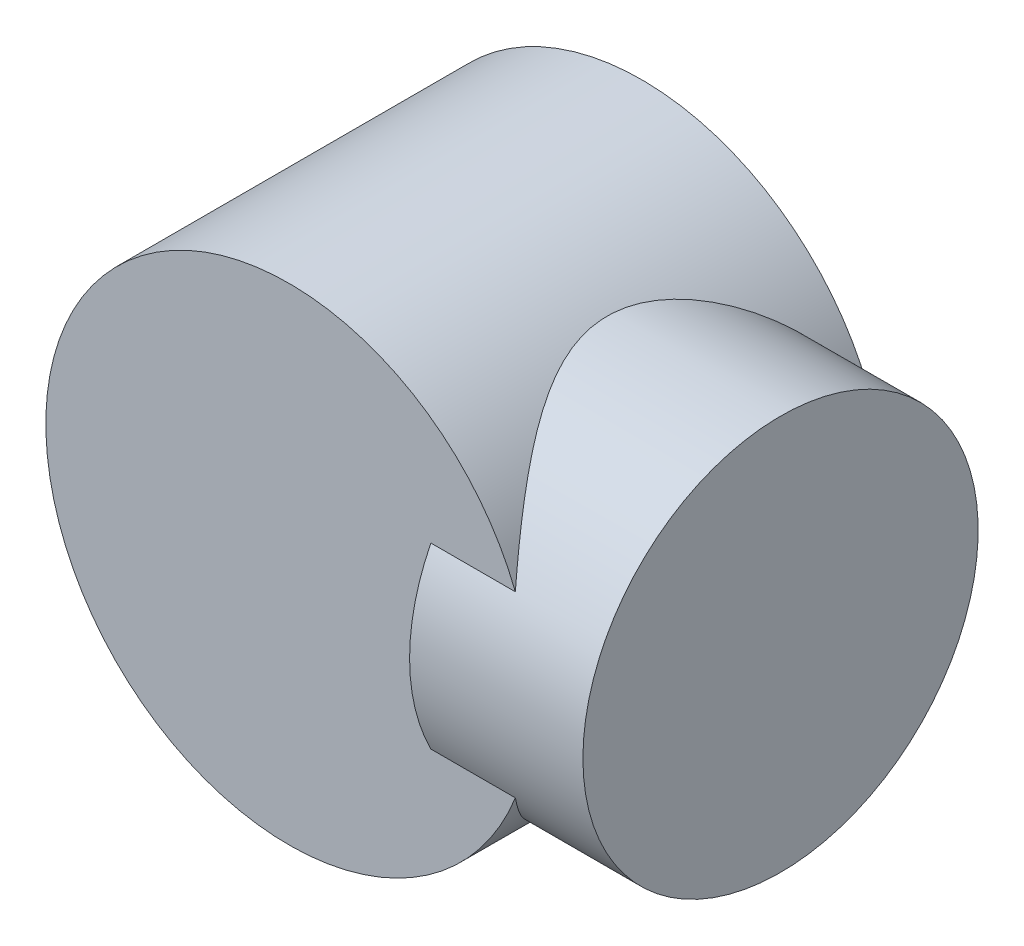
ISO-10303-21;
HEADER;
FILE_DESCRIPTION(('STEP AP214'),'2;1');
FILE_NAME('part.step','',(''),(''),'','','');
FILE_SCHEMA(('AUTOMOTIVE_DESIGN { 1 0 10303 214 1 1 1 1 }'));
ENDSEC;
DATA;
#1=APPLICATION_CONTEXT('core data for automotive mechanical design processes');
#2=APPLICATION_PROTOCOL_DEFINITION('international standard','automotive_design',2000,#1);
#3=PRODUCT_CONTEXT('',#1,'mechanical');
#4=PRODUCT('Part','Part','',(#3));
#5=PRODUCT_RELATED_PRODUCT_CATEGORY('part','',(#4));
#6=PRODUCT_DEFINITION_FORMATION('','',#4);
#7=PRODUCT_DEFINITION_CONTEXT('part definition',#1,'design');
#8=PRODUCT_DEFINITION('design','',#6,#7);
#9=PRODUCT_DEFINITION_SHAPE('','',#8);
#10=(LENGTH_UNIT() NAMED_UNIT(*) SI_UNIT(.MILLI.,.METRE.));
#11=(NAMED_UNIT(*) PLANE_ANGLE_UNIT() SI_UNIT($,.RADIAN.));
#12=(NAMED_UNIT(*) SI_UNIT($,.STERADIAN.) SOLID_ANGLE_UNIT());
#13=UNCERTAINTY_MEASURE_WITH_UNIT(LENGTH_MEASURE(1.E-05),#10,'distance_accuracy_value','');
#14=(GEOMETRIC_REPRESENTATION_CONTEXT(3) GLOBAL_UNCERTAINTY_ASSIGNED_CONTEXT((#13)) GLOBAL_UNIT_ASSIGNED_CONTEXT((#10,
#11,#12)) REPRESENTATION_CONTEXT('',''));
#15=CARTESIAN_POINT('',(0.,0.,0.));
#16=DIRECTION('',(0.,0.,1.));
#17=DIRECTION('',(1.,0.,0.));
#18=AXIS2_PLACEMENT_3D('',#15,#16,#17);
#19=CARTESIAN_POINT('',(0.,0.,0.));
#20=DIRECTION('',(-1.,0.,0.));
#21=DIRECTION('',(0.,-1.,0.));
#22=AXIS2_PLACEMENT_3D('',#19,#20,#21);
#23=SPHERICAL_SURFACE('',#22,40.);
#24=CARTESIAN_POINT('',(0.,0.,-29.));
#25=DIRECTION('',(0.,0.,1.));
#26=DIRECTION('',(1.,0.,0.));
#27=AXIS2_PLACEMENT_3D('',#24,#25,#26);
#28=CIRCLE('',#27,27.5499546279118);
#29=CARTESIAN_POINT('',(23.318447632722,14.6714007511212,-29.));
#30=VERTEX_POINT('',#29);
#31=CARTESIAN_POINT('',(23.318447632722,-14.6714007511212,-29.));
#32=VERTEX_POINT('',#31);
#33=EDGE_CURVE('E42',#30,#32,#28,.F.);
#34=ORIENTED_EDGE('',*,*,#33,.F.);
#35=CARTESIAN_POINT('',(23.318447632722,0.,0.));
#36=DIRECTION('',(-1.,0.,0.));
#37=DIRECTION('',(0.,0.,1.));
#38=AXIS2_PLACEMENT_3D('',#35,#36,#37);
#39=CIRCLE('',#38,32.5);
#40=EDGE_CURVE('E85',#30,#32,#39,.T.);
#41=ORIENTED_EDGE('',*,*,#40,.T.);
#42=EDGE_LOOP('',(#34,#41));
#43=FACE_BOUND('',#42,.T.);
#44=ADVANCED_FACE('F33',(#43),#23,.F.);
#45=CARTESIAN_POINT('',(-78.4468096761824,0.,0.));
#46=DIRECTION('',(-1.,0.,0.));
#47=DIRECTION('',(0.,0.,1.));
#48=AXIS2_PLACEMENT_3D('',#45,#46,#47);
#49=CYLINDRICAL_SURFACE('',#48,32.5);
#50=CARTESIAN_POINT('',(51.818447632722,0.,0.));
#51=DIRECTION('',(-1.,0.,0.));
#52=DIRECTION('',(0.,0.,1.));
#53=AXIS2_PLACEMENT_3D('',#50,#51,#52);
#54=CIRCLE('',#53,32.5);
#55=CARTESIAN_POINT('',(51.818447632722,0.,32.5));
#56=VERTEX_POINT('',#55);
#57=EDGE_CURVE('E86',#56,#56,#54,.T.);
#58=ORIENTED_EDGE('',*,*,#57,.T.);
#59=EDGE_LOOP('',(#58));
#60=FACE_BOUND('',#59,.T.);
#61=CARTESIAN_POINT('',(37.2122291726792,14.6714007511212,29.));
#62=CARTESIAN_POINT('',(37.0384167623299,15.1122605845425,28.7769598931221));
#63=CARTESIAN_POINT('',(36.8583653139083,15.5459710546819,28.5449194092489));
#64=CARTESIAN_POINT('',(36.4869726212096,16.398690521123,28.0637247785879));
#65=CARTESIAN_POINT('',(36.2956337705475,16.8177026045358,27.8145742583409));
#66=CARTESIAN_POINT('',(35.7069274397426,18.0511594606156,27.0433924829334));
#67=CARTESIAN_POINT('',(35.2943554901186,18.8433149043838,26.4969742635263));
#68=CARTESIAN_POINT('',(34.4389661407464,20.3646416146593,25.3464066607002));
#69=CARTESIAN_POINT('',(33.9961879944246,21.0938919367934,24.7423318101723));
#70=CARTESIAN_POINT('',(33.0890630414845,22.4901543823152,23.4803900810878));
#71=CARTESIAN_POINT('',(32.6247093172204,23.1571463350411,22.8225058978467));
#72=CARTESIAN_POINT('',(31.6865447527366,24.4250206612744,21.459966980059));
#73=CARTESIAN_POINT('',(31.2127936994698,25.0262206597636,20.7555659178486));
#74=CARTESIAN_POINT('',(30.2636386593102,26.1660469642867,19.2987938388735));
#75=CARTESIAN_POINT('',(29.7882345827837,26.7046698208677,18.5464201812426));
#76=CARTESIAN_POINT('',(28.8472012627928,27.718539044388,16.9938996965338));
#77=CARTESIAN_POINT('',(28.3815750117378,28.1937662411716,16.1937385244456));
#78=CARTESIAN_POINT('',(27.4742861337567,29.078589884962,14.5451167559236));
#79=CARTESIAN_POINT('',(27.0326135630219,29.4882137057492,13.6966765058424));
#80=CARTESIAN_POINT('',(26.3396542964211,30.1057468310995,12.2585321119091));
#81=CARTESIAN_POINT('',(26.0762188375706,30.3338033614416,11.6832764501992));
#82=CARTESIAN_POINT('',(25.5727008909894,30.7594785188378,10.5115632451592));
#83=CARTESIAN_POINT('',(25.3326168063888,30.9570992277676,9.91510715542229));
#84=CARTESIAN_POINT('',(24.8830956661389,31.3195594890496,8.70256673912427));
#85=CARTESIAN_POINT('',(24.6735915336505,31.484471082846,8.08652909530239));
#86=CARTESIAN_POINT('',(24.2921609603323,31.7796979439348,6.83476164913399));
#87=CARTESIAN_POINT('',(24.1202266862416,31.9100204242255,6.19903598333128));
#88=CARTESIAN_POINT('',(23.8474471419866,32.1142194620964,5.02190198469967));
#89=CARTESIAN_POINT('',(23.7394523194919,32.1939577848796,4.48317079551863));
#90=CARTESIAN_POINT('',(23.5584384095929,32.3266554532461,3.39657967097836));
#91=CARTESIAN_POINT('',(23.4854150208813,32.3796180921461,2.84872086685065));
#92=CARTESIAN_POINT('',(23.3774421585089,32.4576598958425,1.7477324855759));
#93=CARTESIAN_POINT('',(23.3424593266045,32.4827634909834,1.19460795614432));
#94=CARTESIAN_POINT('',(23.3120337380851,32.5046066425837,0.0866894809239509));
#95=CARTESIAN_POINT('',(23.3165914085461,32.5013458926804,-0.468104482831654));
#96=CARTESIAN_POINT('',(23.3650232160526,32.466545069523,-1.57472296858484));
#97=CARTESIAN_POINT('',(23.4088738003759,32.4350219371298,-2.12654907024808));
#98=CARTESIAN_POINT('',(23.5339022728001,32.3444175071453,-3.22361216932175));
#99=CARTESIAN_POINT('',(23.6150805988497,32.2853358862233,-3.7688490893474));
#100=CARTESIAN_POINT('',(23.8115856406616,32.1406784963566,-4.8502385324178));
#101=CARTESIAN_POINT('',(23.9269567259795,32.0550682965101,-5.38637828906145));
#102=CARTESIAN_POINT('',(24.1876912673613,31.8587850412282,-6.44659900183687));
#103=CARTESIAN_POINT('',(24.3330590289293,31.7481083877144,-6.97067821487026));
#104=CARTESIAN_POINT('',(24.7298388314471,31.4408327048534,-8.26843980965477));
#105=CARTESIAN_POINT('',(24.9975943232823,31.2291549584267,-9.03358734879068));
#106=CARTESIAN_POINT('',(25.5769690183773,30.7564364540254,-10.5313419382675));
#107=CARTESIAN_POINT('',(25.8886115949744,30.4953693667198,-11.2639313735405));
#108=CARTESIAN_POINT('',(26.544323340494,29.9263761922772,-12.6988036538835));
#109=CARTESIAN_POINT('',(26.8884981679764,29.6182952738407,-13.40097613849));
#110=CARTESIAN_POINT('',(27.5980112165351,28.9583237412365,-14.773120205246));
#111=CARTESIAN_POINT('',(27.9633480424754,28.6064360133434,-15.4430939048317));
#112=CARTESIAN_POINT('',(28.5874996235268,27.9800462844158,-16.5417224239395));
#113=CARTESIAN_POINT('',(28.8429039255966,27.7169151798442,-16.978865756075));
#114=CARTESIAN_POINT('',(29.3573508583995,27.1714291483286,-17.8387972457827));
#115=CARTESIAN_POINT('',(29.6163937101909,26.889073049335,-18.2615845257807));
#116=CARTESIAN_POINT('',(30.3960264718258,26.0133053232636,-19.508735076768));
#117=CARTESIAN_POINT('',(30.9190436378415,25.3912703550785,-20.3117538813887));
#118=CARTESIAN_POINT('',(31.9552747673759,24.0740719434374,-21.8567168391787));
#119=CARTESIAN_POINT('',(32.4685139931358,23.3791399866573,-22.5988417398229));
#120=CARTESIAN_POINT('',(33.4739590822312,21.9153436144536,-24.0210011983604));
#121=CARTESIAN_POINT('',(33.966176462341,21.1465204505243,-24.7010699918388));
#122=CARTESIAN_POINT('',(34.9510425271759,19.4788542467607,-26.0392886194626));
#123=CARTESIAN_POINT('',(35.4413317645029,18.5746844129556,-26.6926098232138));
#124=CARTESIAN_POINT('',(36.1374301642255,17.1570426684896,-27.6080234230318));
#125=CARTESIAN_POINT('',(36.3630434818513,16.6739237430142,-27.9025736454544));
#126=CARTESIAN_POINT('',(36.7993315312936,15.6875793510455,-28.4688119808912));
#127=CARTESIAN_POINT('',(37.0099984491969,15.1843435793702,-28.7404881491061));
#128=CARTESIAN_POINT('',(37.2122291726792,14.6714007511212,-29.));
#129=B_SPLINE_CURVE_WITH_KNOTS('',3,(#61,#62,#63,#64,#65,#66,#67,#68,#69,#70,#71,#72,#73,#74,
#75,#76,#77,#78,#79,#80,#81,#82,#83,#84,#85,#86,#87,#88,#89,#90,#91,#92,#93,#94,#95,#96,#97,#98,
#99,#100,#101,#102,#103,#104,#105,#106,#107,#108,#109,#110,#111,#112,#113,#114,#115,#116,#117,
#118,#119,#120,#121,#122,#123,#124,#125,#126,#127,#128),.UNSPECIFIED.,.F.,.F.,(4,2,2,2,2,2,2,2,
2,2,2,2,2,2,2,2,2,2,2,2,2,2,2,2,2,2,2,2,2,2,2,2,2,4),(0.,1.57088691116131,3.14144188809385,
6.27796128681927,9.41047964002541,12.5440093791268,15.6616735380362,18.7795094711437,
21.8982860769749,25.0157579268885,27.0322215576206,29.0485471965819,31.0603813460555,
33.0717956299384,34.7357576775307,36.3995150137222,38.0618122006495,39.7241273420308,
41.3854467345226,43.0467856189861,44.7102898168798,46.3740329483118,48.8834706302452,
51.3942498760453,53.9134838443318,56.4325519170262,58.1437994009681,59.8551513044877,
63.2783682849639,66.6910261851581,70.1017898353035,73.7501973060817,75.5768233346882,
77.4043973841075),.UNSPECIFIED.);
#130=CARTESIAN_POINT('',(37.2122291726792,14.6714007511212,29.));
#131=VERTEX_POINT('',#130);
#132=CARTESIAN_POINT('',(37.2122291726792,14.6714007511212,-29.));
#133=VERTEX_POINT('',#132);
#134=EDGE_CURVE('E56',#131,#133,#129,.T.);
#135=ORIENTED_EDGE('',*,*,#134,.F.);
#136=DIRECTION('',(-1.,0.,0.));
#137=VECTOR('',#136,1.);
#138=CARTESIAN_POINT('',(-78.4468096761824,14.6714007511212,29.));
#139=LINE('',#138,#137);
#140=CARTESIAN_POINT('',(23.318447632722,14.6714007511212,29.));
#141=VERTEX_POINT('',#140);
#142=EDGE_CURVE('E72',#131,#141,#139,.T.);
#143=ORIENTED_EDGE('',*,*,#142,.T.);
#144=CARTESIAN_POINT('',(23.318447632722,-14.6714007511212,29.));
#145=VERTEX_POINT('',#144);
#146=EDGE_CURVE('E75',#145,#141,#39,.T.);
#147=ORIENTED_EDGE('',*,*,#146,.F.);
#148=DIRECTION('',(-1.,0.,0.));
#149=VECTOR('',#148,1.);
#150=CARTESIAN_POINT('',(-78.4468096761824,-14.6714007511212,29.));
#151=LINE('',#150,#149);
#152=CARTESIAN_POINT('',(37.2122291726792,-14.6714007511212,29.));
#153=VERTEX_POINT('',#152);
#154=EDGE_CURVE('E89',#145,#153,#151,.F.);
#155=ORIENTED_EDGE('',*,*,#154,.T.);
#156=CARTESIAN_POINT('',(37.2122291726792,-14.6714007511212,-29.));
#157=CARTESIAN_POINT('',(37.0384167623299,-15.1122605845425,-28.7769598931221));
#158=CARTESIAN_POINT('',(36.8583653139083,-15.5459710546819,-28.5449194092489));
#159=CARTESIAN_POINT('',(36.4869726212096,-16.398690521123,-28.0637247785879));
#160=CARTESIAN_POINT('',(36.2956337705475,-16.8177026045358,-27.8145742583409));
#161=CARTESIAN_POINT('',(35.7069274397426,-18.0511594606157,-27.0433924829334));
#162=CARTESIAN_POINT('',(35.2943554901186,-18.8433149043838,-26.4969742635263));
#163=CARTESIAN_POINT('',(34.4389661407463,-20.3646416146593,-25.3464066607002));
#164=CARTESIAN_POINT('',(33.9961879944245,-21.0938919367935,-24.7423318101723));
#165=CARTESIAN_POINT('',(33.0890630414845,-22.4901543823152,-23.4803900810878));
#166=CARTESIAN_POINT('',(32.6247093172204,-23.1571463350411,-22.8225058978466));
#167=CARTESIAN_POINT('',(31.6865447527366,-24.4250206612745,-21.459966980059));
#168=CARTESIAN_POINT('',(31.2127936994698,-25.0262206597637,-20.7555659178486));
#169=CARTESIAN_POINT('',(30.2636386593102,-26.1660469642868,-19.2987938388734));
#170=CARTESIAN_POINT('',(29.7882345827837,-26.7046698208677,-18.5464201812426));
#171=CARTESIAN_POINT('',(28.8472012627928,-27.718539044388,-16.9938996965338));
#172=CARTESIAN_POINT('',(28.3815750117378,-28.1937662411716,-16.1937385244456));
#173=CARTESIAN_POINT('',(27.4742861337567,-29.078589884962,-14.5451167559236));
#174=CARTESIAN_POINT('',(27.0326135630219,-29.4882137057492,-13.6966765058424));
#175=CARTESIAN_POINT('',(26.3396542964211,-30.1057468310995,-12.2585321119091));
#176=CARTESIAN_POINT('',(26.0762188375706,-30.3338033614416,-11.6832764501991));
#177=CARTESIAN_POINT('',(25.5727008909894,-30.7594785188378,-10.5115632451592));
#178=CARTESIAN_POINT('',(25.3326168063888,-30.9570992277676,-9.91510715542224));
#179=CARTESIAN_POINT('',(24.8830956661389,-31.3195594890496,-8.70256673912423));
#180=CARTESIAN_POINT('',(24.6735915336505,-31.484471082846,-8.08652909530235));
#181=CARTESIAN_POINT('',(24.2921609603323,-31.7796979439348,-6.83476164913395));
#182=CARTESIAN_POINT('',(24.1202266862416,-31.9100204242256,-6.19903598333125));
#183=CARTESIAN_POINT('',(23.8474471419866,-32.1142194620964,-5.02190198469963));
#184=CARTESIAN_POINT('',(23.7394523194919,-32.1939577848796,-4.48317079551859));
#185=CARTESIAN_POINT('',(23.5584384095929,-32.3266554532461,-3.39657967097832));
#186=CARTESIAN_POINT('',(23.4854150208813,-32.3796180921461,-2.84872086685061));
#187=CARTESIAN_POINT('',(23.3774421585089,-32.4576598958425,-1.74773248557586));
#188=CARTESIAN_POINT('',(23.3424593266045,-32.4827634909834,-1.19460795614428));
#189=CARTESIAN_POINT('',(23.3120337380851,-32.5046066425837,-0.0866894809239108));
#190=CARTESIAN_POINT('',(23.3165914085462,-32.5013458926804,0.46810448283169));
#191=CARTESIAN_POINT('',(23.3650232160526,-32.466545069523,1.57472296858488));
#192=CARTESIAN_POINT('',(23.408873800376,-32.4350219371298,2.12654907024811));
#193=CARTESIAN_POINT('',(23.5339022728001,-32.3444175071453,3.22361216932178));
#194=CARTESIAN_POINT('',(23.6150805988497,-32.2853358862233,3.76884908934743));
#195=CARTESIAN_POINT('',(23.8115856406616,-32.1406784963566,4.85023853241783));
#196=CARTESIAN_POINT('',(23.9269567259795,-32.0550682965101,5.38637828906148));
#197=CARTESIAN_POINT('',(24.1876912673614,-31.8587850412282,6.44659900183689));
#198=CARTESIAN_POINT('',(24.3330590289293,-31.7481083877144,6.97067821487028));
#199=CARTESIAN_POINT('',(24.7298388314471,-31.4408327048534,8.2684398096548));
#200=CARTESIAN_POINT('',(24.9975943232823,-31.2291549584267,9.03358734879071));
#201=CARTESIAN_POINT('',(25.5769690183773,-30.7564364540254,10.5313419382676));
#202=CARTESIAN_POINT('',(25.8886115949744,-30.4953693667198,11.2639313735405));
#203=CARTESIAN_POINT('',(26.544323340494,-29.9263761922772,12.6988036538835));
#204=CARTESIAN_POINT('',(26.8884981679764,-29.6182952738407,13.40097613849));
#205=CARTESIAN_POINT('',(27.5980112165351,-28.9583237412365,14.7731202052461));
#206=CARTESIAN_POINT('',(27.9633480424754,-28.6064360133434,15.4430939048317));
#207=CARTESIAN_POINT('',(28.5874996235268,-27.9800462844158,16.5417224239395));
#208=CARTESIAN_POINT('',(28.8429039255966,-27.7169151798442,16.978865756075));
#209=CARTESIAN_POINT('',(29.3573508583995,-27.1714291483286,17.8387972457827));
#210=CARTESIAN_POINT('',(29.6163937101909,-26.8890730493349,18.2615845257807));
#211=CARTESIAN_POINT('',(30.3960264718258,-26.0133053232636,19.508735076768));
#212=CARTESIAN_POINT('',(30.9190436378415,-25.3912703550785,20.3117538813888));
#213=CARTESIAN_POINT('',(31.9552747673759,-24.0740719434374,21.8567168391787));
#214=CARTESIAN_POINT('',(32.4685139931358,-23.3791399866573,22.5988417398229));
#215=CARTESIAN_POINT('',(33.4739590822312,-21.9153436144536,24.0210011983605));
#216=CARTESIAN_POINT('',(33.9661764623411,-21.1465204505243,24.7010699918389));
#217=CARTESIAN_POINT('',(34.951042527176,-19.4788542467607,26.0392886194626));
#218=CARTESIAN_POINT('',(35.4413317645029,-18.5746844129555,26.6926098232138));
#219=CARTESIAN_POINT('',(36.1374301642256,-17.1570426684896,27.6080234230318));
#220=CARTESIAN_POINT('',(36.3630434818513,-16.6739237430142,27.9025736454544));
#221=CARTESIAN_POINT('',(36.7993315312936,-15.6875793510454,28.4688119808912));
#222=CARTESIAN_POINT('',(37.0099984491969,-15.1843435793702,28.7404881491061));
#223=CARTESIAN_POINT('',(37.2122291726792,-14.6714007511212,29.));
#224=B_SPLINE_CURVE_WITH_KNOTS('',3,(#156,#157,#158,#159,#160,#161,#162,#163,#164,#165,#166,
#167,#168,#169,#170,#171,#172,#173,#174,#175,#176,#177,#178,#179,#180,#181,#182,#183,#184,#185,
#186,#187,#188,#189,#190,#191,#192,#193,#194,#195,#196,#197,#198,#199,#200,#201,#202,#203,#204,
#205,#206,#207,#208,#209,#210,#211,#212,#213,#214,#215,#216,#217,#218,#219,#220,#221,#222,#223),
.UNSPECIFIED.,.F.,.F.,(4,2,2,2,2,2,2,2,2,2,2,2,2,2,2,2,2,2,2,2,2,2,2,2,2,2,2,2,2,2,2,2,2,4),(0.,
1.57088691116131,3.14144188809386,6.27796128681928,9.41047964002542,12.5440093791268,
15.6616735380362,18.7795094711438,21.8982860769749,25.0157579268885,27.0322215576206,
29.048547196582,31.0603813460556,33.0717956299384,34.7357576775307,36.3995150137222,
38.0618122006496,39.7241273420308,41.3854467345226,43.0467856189861,44.7102898168798,
46.3740329483118,48.8834706302452,51.3942498760453,53.9134838443318,56.4325519170262,
58.1437994009681,59.8551513044877,63.2783682849639,66.6910261851581,70.1017898353036,
73.7501973060817,75.5768233346881,77.4043973841075),.UNSPECIFIED.);
#225=CARTESIAN_POINT('',(37.2122291726792,-14.6714007511212,-29.));
#226=VERTEX_POINT('',#225);
#227=EDGE_CURVE('E49',#226,#153,#224,.T.);
#228=ORIENTED_EDGE('',*,*,#227,.F.);
#229=DIRECTION('',(-1.,0.,0.));
#230=VECTOR('',#229,1.);
#231=CARTESIAN_POINT('',(-78.4468096761824,-14.6714007511212,-29.));
#232=LINE('',#231,#230);
#233=EDGE_CURVE('E97',#32,#226,#232,.F.);
#234=ORIENTED_EDGE('',*,*,#233,.F.);
#235=ORIENTED_EDGE('',*,*,#40,.F.);
#236=DIRECTION('',(-1.,0.,0.));
#237=VECTOR('',#236,1.);
#238=CARTESIAN_POINT('',(-78.4468096761824,14.6714007511212,-29.));
#239=LINE('',#238,#237);
#240=EDGE_CURVE('E11',#133,#30,#239,.T.);
#241=ORIENTED_EDGE('',*,*,#240,.F.);
#242=EDGE_LOOP('',(#135,#143,#147,#155,#228,#234,#235,#241));
#243=FACE_BOUND('',#242,.T.);
#244=ADVANCED_FACE('F74',(#60,#243),#49,.T.);
#245=ORIENTED_EDGE('',*,*,#146,.T.);
#246=CARTESIAN_POINT('',(0.,0.,29.));
#247=DIRECTION('',(0.,0.,1.));
#248=DIRECTION('',(1.,0.,0.));
#249=AXIS2_PLACEMENT_3D('',#246,#247,#248);
#250=CIRCLE('',#249,27.5499546279118);
#251=EDGE_CURVE('E81',#141,#145,#250,.F.);
#252=ORIENTED_EDGE('',*,*,#251,.T.);
#253=EDGE_LOOP('',(#245,#252));
#254=FACE_BOUND('',#253,.T.);
#255=ADVANCED_FACE('F84',(#254),#23,.F.);
#256=CARTESIAN_POINT('',(51.818447632722,0.,0.));
#257=DIRECTION('',(1.,0.,0.));
#258=DIRECTION('',(0.,0.,-1.));
#259=AXIS2_PLACEMENT_3D('',#256,#257,#258);
#260=PLANE('',#259);
#261=ORIENTED_EDGE('',*,*,#57,.F.);
#262=EDGE_LOOP('',(#261));
#263=FACE_BOUND('',#262,.T.);
#264=ADVANCED_FACE('F118',(#263),#260,.T.);
#265=CARTESIAN_POINT('',(0.,0.,29.));
#266=DIRECTION('',(0.,0.,-1.));
#267=DIRECTION('',(-1.,0.,0.));
#268=AXIS2_PLACEMENT_3D('',#265,#266,#267);
#269=CYLINDRICAL_SURFACE('',#268,40.);
#270=CARTESIAN_POINT('',(0.,0.,29.));
#271=DIRECTION('',(0.,0.,1.));
#272=DIRECTION('',(1.,0.,0.));
#273=AXIS2_PLACEMENT_3D('',#270,#271,#272);
#274=CIRCLE('',#273,40.);
#275=EDGE_CURVE('E93',#131,#153,#274,.T.);
#276=ORIENTED_EDGE('',*,*,#275,.F.);
#277=ORIENTED_EDGE('',*,*,#134,.T.);
#278=CARTESIAN_POINT('',(0.,0.,-29.));
#279=DIRECTION('',(0.,0.,1.));
#280=DIRECTION('',(1.,0.,0.));
#281=AXIS2_PLACEMENT_3D('',#278,#279,#280);
#282=CIRCLE('',#281,40.);
#283=EDGE_CURVE('E90',#133,#226,#282,.T.);
#284=ORIENTED_EDGE('',*,*,#283,.T.);
#285=ORIENTED_EDGE('',*,*,#227,.T.);
#286=EDGE_LOOP('',(#276,#277,#284,#285));
#287=FACE_BOUND('',#286,.T.);
#288=ADVANCED_FACE('F35',(#287),#269,.T.);
#289=CARTESIAN_POINT('',(0.,0.,29.));
#290=DIRECTION('',(0.,0.,1.));
#291=DIRECTION('',(1.,0.,0.));
#292=AXIS2_PLACEMENT_3D('',#289,#290,#291);
#293=PLANE('',#292);
#294=ORIENTED_EDGE('',*,*,#142,.F.);
#295=ORIENTED_EDGE('',*,*,#275,.T.);
#296=ORIENTED_EDGE('',*,*,#154,.F.);
#297=ORIENTED_EDGE('',*,*,#251,.F.);
#298=EDGE_LOOP('',(#294,#295,#296,#297));
#299=FACE_BOUND('',#298,.T.);
#300=ADVANCED_FACE('F88',(#299),#293,.T.);
#301=CARTESIAN_POINT('',(0.,0.,-29.));
#302=DIRECTION('',(0.,0.,1.));
#303=DIRECTION('',(1.,0.,0.));
#304=AXIS2_PLACEMENT_3D('',#301,#302,#303);
#305=PLANE('',#304);
#306=ORIENTED_EDGE('',*,*,#283,.F.);
#307=ORIENTED_EDGE('',*,*,#240,.T.);
#308=ORIENTED_EDGE('',*,*,#33,.T.);
#309=ORIENTED_EDGE('',*,*,#233,.T.);
#310=EDGE_LOOP('',(#306,#307,#308,#309));
#311=FACE_BOUND('',#310,.T.);
#312=ADVANCED_FACE('F102',(#311),#305,.F.);
#313=CLOSED_SHELL('',(#44,#244,#255,#264,#288,#300,#312));
#314=MANIFOLD_SOLID_BREP('B2',#313);
#315=ADVANCED_BREP_SHAPE_REPRESENTATION('',(#18,#314),#14);
#316=SHAPE_DEFINITION_REPRESENTATION(#9,#315);
ENDSEC;
END-ISO-10303-21;
